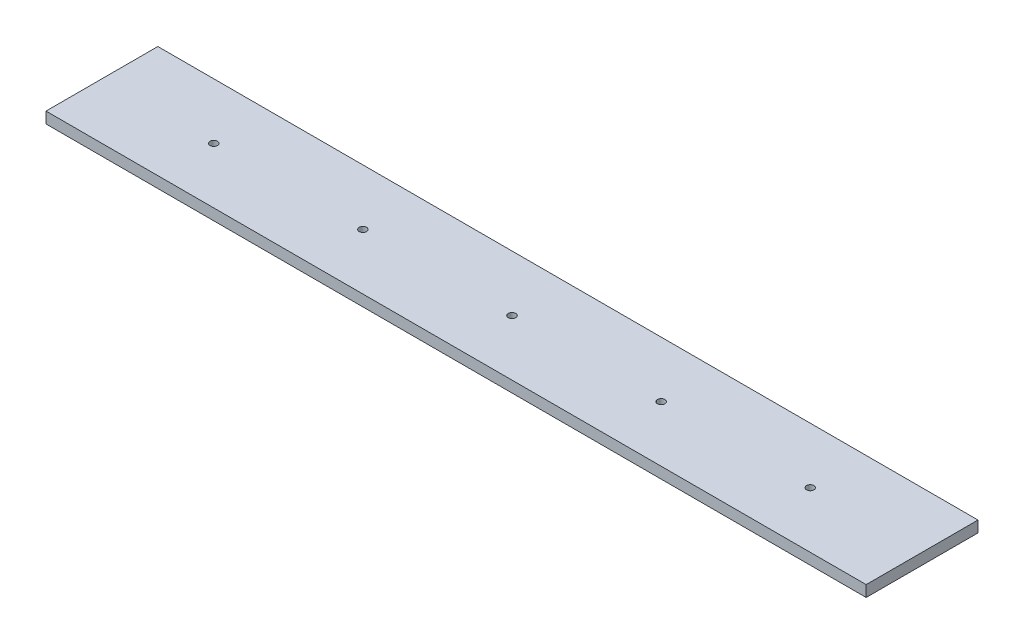
ISO-10303-21;
HEADER;
FILE_DESCRIPTION(('STEP AP214'),'2;1');
FILE_NAME('part.step','',(''),(''),'','','');
FILE_SCHEMA(('AUTOMOTIVE_DESIGN { 1 0 10303 214 1 1 1 1 }'));
ENDSEC;
DATA;
#1=APPLICATION_CONTEXT('core data for automotive mechanical design processes');
#2=APPLICATION_PROTOCOL_DEFINITION('international standard','automotive_design',2000,#1);
#3=PRODUCT_CONTEXT('',#1,'mechanical');
#4=PRODUCT('Part','Part','',(#3));
#5=PRODUCT_RELATED_PRODUCT_CATEGORY('part','',(#4));
#6=PRODUCT_DEFINITION_FORMATION('','',#4);
#7=PRODUCT_DEFINITION_CONTEXT('part definition',#1,'design');
#8=PRODUCT_DEFINITION('design','',#6,#7);
#9=PRODUCT_DEFINITION_SHAPE('','',#8);
#10=(LENGTH_UNIT() NAMED_UNIT(*) SI_UNIT(.MILLI.,.METRE.));
#11=(NAMED_UNIT(*) PLANE_ANGLE_UNIT() SI_UNIT($,.RADIAN.));
#12=(NAMED_UNIT(*) SI_UNIT($,.STERADIAN.) SOLID_ANGLE_UNIT());
#13=UNCERTAINTY_MEASURE_WITH_UNIT(LENGTH_MEASURE(1.E-05),#10,'distance_accuracy_value','');
#14=(GEOMETRIC_REPRESENTATION_CONTEXT(3) GLOBAL_UNCERTAINTY_ASSIGNED_CONTEXT((#13)) GLOBAL_UNIT_ASSIGNED_CONTEXT((#10,
#11,#12)) REPRESENTATION_CONTEXT('',''));
#15=CARTESIAN_POINT('',(0.,0.,0.));
#16=DIRECTION('',(0.,0.,1.));
#17=DIRECTION('',(1.,0.,0.));
#18=AXIS2_PLACEMENT_3D('',#15,#16,#17);
#19=CARTESIAN_POINT('',(0.,3.,0.));
#20=DIRECTION('',(0.,-1.,0.));
#21=DIRECTION('',(0.,0.,-1.));
#22=AXIS2_PLACEMENT_3D('',#19,#20,#21);
#23=PLANE('',#22);
#24=DIRECTION('',(0.,0.,-1.));
#25=VECTOR('',#24,1.);
#26=CARTESIAN_POINT('',(140.,3.,12.5));
#27=LINE('',#26,#25);
#28=CARTESIAN_POINT('',(140.,3.,12.5));
#29=VERTEX_POINT('',#28);
#30=CARTESIAN_POINT('',(140.,3.,-17.5));
#31=VERTEX_POINT('',#30);
#32=EDGE_CURVE('E89',#29,#31,#27,.T.);
#33=ORIENTED_EDGE('',*,*,#32,.T.);
#34=DIRECTION('',(-1.,0.,0.));
#35=VECTOR('',#34,1.);
#36=CARTESIAN_POINT('',(-80.,3.,-17.5));
#37=LINE('',#36,#35);
#38=CARTESIAN_POINT('',(-80.,3.,-17.5));
#39=VERTEX_POINT('',#38);
#40=EDGE_CURVE('E84',#31,#39,#37,.T.);
#41=ORIENTED_EDGE('',*,*,#40,.T.);
#42=DIRECTION('',(0.,0.,1.));
#43=VECTOR('',#42,1.);
#44=CARTESIAN_POINT('',(-80.,3.,12.5));
#45=LINE('',#44,#43);
#46=CARTESIAN_POINT('',(-80.,3.,12.5));
#47=VERTEX_POINT('',#46);
#48=EDGE_CURVE('E87',#39,#47,#45,.T.);
#49=ORIENTED_EDGE('',*,*,#48,.T.);
#50=DIRECTION('',(1.,0.,0.));
#51=VECTOR('',#50,1.);
#52=CARTESIAN_POINT('',(-80.,3.,12.5));
#53=LINE('',#52,#51);
#54=EDGE_CURVE('E54',#47,#29,#53,.T.);
#55=ORIENTED_EDGE('',*,*,#54,.T.);
#56=EDGE_LOOP('',(#33,#41,#49,#55));
#57=FACE_BOUND('',#56,.T.);
#58=CARTESIAN_POINT('',(-50.,3.,-2.5));
#59=DIRECTION('',(0.,1.,0.));
#60=DIRECTION('',(0.,0.,1.));
#61=AXIS2_PLACEMENT_3D('',#58,#59,#60);
#62=CIRCLE('',#61,0.999999999999998);
#63=CARTESIAN_POINT('',(-50.,3.,-1.5));
#64=VERTEX_POINT('',#63);
#65=EDGE_CURVE('E104',#64,#64,#62,.T.);
#66=ORIENTED_EDGE('',*,*,#65,.F.);
#67=EDGE_LOOP('',(#66));
#68=FACE_BOUND('',#67,.T.);
#69=CARTESIAN_POINT('',(-10.,3.,-2.5));
#70=DIRECTION('',(0.,1.,0.));
#71=DIRECTION('',(0.,0.,1.));
#72=AXIS2_PLACEMENT_3D('',#69,#70,#71);
#73=CIRCLE('',#72,1.);
#74=CARTESIAN_POINT('',(-10.,3.,-1.5));
#75=VERTEX_POINT('',#74);
#76=EDGE_CURVE('E119',#75,#75,#73,.T.);
#77=ORIENTED_EDGE('',*,*,#76,.F.);
#78=EDGE_LOOP('',(#77));
#79=FACE_BOUND('',#78,.T.);
#80=CARTESIAN_POINT('',(30.,3.,-2.5));
#81=DIRECTION('',(0.,1.,0.));
#82=DIRECTION('',(0.,0.,1.));
#83=AXIS2_PLACEMENT_3D('',#80,#81,#82);
#84=CIRCLE('',#83,1.);
#85=CARTESIAN_POINT('',(30.,3.,-1.5));
#86=VERTEX_POINT('',#85);
#87=EDGE_CURVE('E125',#86,#86,#84,.T.);
#88=ORIENTED_EDGE('',*,*,#87,.F.);
#89=EDGE_LOOP('',(#88));
#90=FACE_BOUND('',#89,.T.);
#91=CARTESIAN_POINT('',(70.,3.,-2.5));
#92=DIRECTION('',(0.,1.,0.));
#93=DIRECTION('',(0.,0.,1.));
#94=AXIS2_PLACEMENT_3D('',#91,#92,#93);
#95=CIRCLE('',#94,0.999999999999998);
#96=CARTESIAN_POINT('',(70.,3.,-1.5));
#97=VERTEX_POINT('',#96);
#98=EDGE_CURVE('E131',#97,#97,#95,.T.);
#99=ORIENTED_EDGE('',*,*,#98,.F.);
#100=EDGE_LOOP('',(#99));
#101=FACE_BOUND('',#100,.T.);
#102=CARTESIAN_POINT('',(110.,3.,-2.5));
#103=DIRECTION('',(0.,1.,0.));
#104=DIRECTION('',(0.,0.,1.));
#105=AXIS2_PLACEMENT_3D('',#102,#103,#104);
#106=CIRCLE('',#105,0.999999999999998);
#107=CARTESIAN_POINT('',(110.,3.,-1.5));
#108=VERTEX_POINT('',#107);
#109=EDGE_CURVE('E137',#108,#108,#106,.T.);
#110=ORIENTED_EDGE('',*,*,#109,.F.);
#111=EDGE_LOOP('',(#110));
#112=FACE_BOUND('',#111,.T.);
#113=ADVANCED_FACE('F37',(#57,#68,#79,#90,#101,#112),#23,.F.);
#114=CARTESIAN_POINT('',(0.,0.,0.));
#115=DIRECTION('',(0.,-1.,0.));
#116=DIRECTION('',(0.,0.,-1.));
#117=AXIS2_PLACEMENT_3D('',#114,#115,#116);
#118=PLANE('',#117);
#119=CARTESIAN_POINT('',(70.,0.,-2.5));
#120=DIRECTION('',(0.,1.,0.));
#121=DIRECTION('',(0.,0.,1.));
#122=AXIS2_PLACEMENT_3D('',#119,#120,#121);
#123=CIRCLE('',#122,0.999999999999998);
#124=CARTESIAN_POINT('',(70.,0.,-1.5));
#125=VERTEX_POINT('',#124);
#126=EDGE_CURVE('E134',#125,#125,#123,.T.);
#127=ORIENTED_EDGE('',*,*,#126,.T.);
#128=EDGE_LOOP('',(#127));
#129=FACE_BOUND('',#128,.T.);
#130=CARTESIAN_POINT('',(-10.,0.,-2.5));
#131=DIRECTION('',(0.,1.,0.));
#132=DIRECTION('',(0.,0.,1.));
#133=AXIS2_PLACEMENT_3D('',#130,#131,#132);
#134=CIRCLE('',#133,1.);
#135=CARTESIAN_POINT('',(-10.,0.,-1.5));
#136=VERTEX_POINT('',#135);
#137=EDGE_CURVE('E122',#136,#136,#134,.T.);
#138=ORIENTED_EDGE('',*,*,#137,.T.);
#139=EDGE_LOOP('',(#138));
#140=FACE_BOUND('',#139,.T.);
#141=DIRECTION('',(0.,0.,-1.));
#142=VECTOR('',#141,1.);
#143=CARTESIAN_POINT('',(140.,0.,12.5));
#144=LINE('',#143,#142);
#145=CARTESIAN_POINT('',(140.,0.,12.5));
#146=VERTEX_POINT('',#145);
#147=CARTESIAN_POINT('',(140.,0.,-17.5));
#148=VERTEX_POINT('',#147);
#149=EDGE_CURVE('E101',#146,#148,#144,.T.);
#150=ORIENTED_EDGE('',*,*,#149,.F.);
#151=DIRECTION('',(1.,0.,0.));
#152=VECTOR('',#151,1.);
#153=CARTESIAN_POINT('',(-80.,0.,12.5));
#154=LINE('',#153,#152);
#155=CARTESIAN_POINT('',(-80.,0.,12.5));
#156=VERTEX_POINT('',#155);
#157=EDGE_CURVE('E77',#156,#146,#154,.T.);
#158=ORIENTED_EDGE('',*,*,#157,.F.);
#159=DIRECTION('',(0.,0.,1.));
#160=VECTOR('',#159,1.);
#161=CARTESIAN_POINT('',(-80.,0.,12.5));
#162=LINE('',#161,#160);
#163=CARTESIAN_POINT('',(-80.,0.,-17.5));
#164=VERTEX_POINT('',#163);
#165=EDGE_CURVE('E71',#164,#156,#162,.T.);
#166=ORIENTED_EDGE('',*,*,#165,.F.);
#167=DIRECTION('',(-1.,0.,0.));
#168=VECTOR('',#167,1.);
#169=CARTESIAN_POINT('',(-80.,0.,-17.5));
#170=LINE('',#169,#168);
#171=EDGE_CURVE('E93',#148,#164,#170,.T.);
#172=ORIENTED_EDGE('',*,*,#171,.F.);
#173=EDGE_LOOP('',(#150,#158,#166,#172));
#174=FACE_BOUND('',#173,.T.);
#175=CARTESIAN_POINT('',(-50.,0.,-2.5));
#176=DIRECTION('',(0.,1.,0.));
#177=DIRECTION('',(0.,0.,1.));
#178=AXIS2_PLACEMENT_3D('',#175,#176,#177);
#179=CIRCLE('',#178,0.999999999999998);
#180=CARTESIAN_POINT('',(-50.,0.,-1.5));
#181=VERTEX_POINT('',#180);
#182=EDGE_CURVE('E116',#181,#181,#179,.T.);
#183=ORIENTED_EDGE('',*,*,#182,.T.);
#184=EDGE_LOOP('',(#183));
#185=FACE_BOUND('',#184,.T.);
#186=CARTESIAN_POINT('',(30.,0.,-2.5));
#187=DIRECTION('',(0.,1.,0.));
#188=DIRECTION('',(0.,0.,1.));
#189=AXIS2_PLACEMENT_3D('',#186,#187,#188);
#190=CIRCLE('',#189,1.);
#191=CARTESIAN_POINT('',(30.,0.,-1.5));
#192=VERTEX_POINT('',#191);
#193=EDGE_CURVE('E128',#192,#192,#190,.T.);
#194=ORIENTED_EDGE('',*,*,#193,.T.);
#195=EDGE_LOOP('',(#194));
#196=FACE_BOUND('',#195,.T.);
#197=CARTESIAN_POINT('',(110.,0.,-2.5));
#198=DIRECTION('',(0.,1.,0.));
#199=DIRECTION('',(0.,0.,1.));
#200=AXIS2_PLACEMENT_3D('',#197,#198,#199);
#201=CIRCLE('',#200,0.999999999999998);
#202=CARTESIAN_POINT('',(110.,0.,-1.5));
#203=VERTEX_POINT('',#202);
#204=EDGE_CURVE('E140',#203,#203,#201,.T.);
#205=ORIENTED_EDGE('',*,*,#204,.T.);
#206=EDGE_LOOP('',(#205));
#207=FACE_BOUND('',#206,.T.);
#208=ADVANCED_FACE('F112',(#129,#140,#174,#185,#196,#207),#118,.T.);
#209=CARTESIAN_POINT('',(140.,3.,12.5));
#210=DIRECTION('',(-1.,0.,0.));
#211=DIRECTION('',(0.,0.,1.));
#212=AXIS2_PLACEMENT_3D('',#209,#210,#211);
#213=PLANE('',#212);
#214=ORIENTED_EDGE('',*,*,#149,.T.);
#215=DIRECTION('',(0.,-1.,0.));
#216=VECTOR('',#215,1.);
#217=CARTESIAN_POINT('',(140.,3.,-17.5));
#218=LINE('',#217,#216);
#219=EDGE_CURVE('E11',#31,#148,#218,.T.);
#220=ORIENTED_EDGE('',*,*,#219,.F.);
#221=ORIENTED_EDGE('',*,*,#32,.F.);
#222=DIRECTION('',(0.,-1.,0.));
#223=VECTOR('',#222,1.);
#224=CARTESIAN_POINT('',(140.,3.,12.5));
#225=LINE('',#224,#223);
#226=EDGE_CURVE('E97',#29,#146,#225,.T.);
#227=ORIENTED_EDGE('',*,*,#226,.T.);
#228=EDGE_LOOP('',(#214,#220,#221,#227));
#229=FACE_BOUND('',#228,.T.);
#230=ADVANCED_FACE('F39',(#229),#213,.F.);
#231=CARTESIAN_POINT('',(-80.,3.,-17.5));
#232=DIRECTION('',(0.,0.,1.));
#233=DIRECTION('',(1.,0.,0.));
#234=AXIS2_PLACEMENT_3D('',#231,#232,#233);
#235=PLANE('',#234);
#236=ORIENTED_EDGE('',*,*,#171,.T.);
#237=DIRECTION('',(0.,-1.,0.));
#238=VECTOR('',#237,1.);
#239=CARTESIAN_POINT('',(-80.,3.,-17.5));
#240=LINE('',#239,#238);
#241=EDGE_CURVE('E46',#39,#164,#240,.T.);
#242=ORIENTED_EDGE('',*,*,#241,.F.);
#243=ORIENTED_EDGE('',*,*,#40,.F.);
#244=ORIENTED_EDGE('',*,*,#219,.T.);
#245=EDGE_LOOP('',(#236,#242,#243,#244));
#246=FACE_BOUND('',#245,.T.);
#247=ADVANCED_FACE('F92',(#246),#235,.F.);
#248=CARTESIAN_POINT('',(-80.,3.,12.5));
#249=DIRECTION('',(1.,0.,0.));
#250=DIRECTION('',(0.,0.,-1.));
#251=AXIS2_PLACEMENT_3D('',#248,#249,#250);
#252=PLANE('',#251);
#253=ORIENTED_EDGE('',*,*,#165,.T.);
#254=DIRECTION('',(0.,-1.,0.));
#255=VECTOR('',#254,1.);
#256=CARTESIAN_POINT('',(-80.,3.,12.5));
#257=LINE('',#256,#255);
#258=EDGE_CURVE('E94',#47,#156,#257,.T.);
#259=ORIENTED_EDGE('',*,*,#258,.F.);
#260=ORIENTED_EDGE('',*,*,#48,.F.);
#261=ORIENTED_EDGE('',*,*,#241,.T.);
#262=EDGE_LOOP('',(#253,#259,#260,#261));
#263=FACE_BOUND('',#262,.T.);
#264=ADVANCED_FACE('F95',(#263),#252,.F.);
#265=CARTESIAN_POINT('',(-80.,3.,12.5));
#266=DIRECTION('',(0.,0.,-1.));
#267=DIRECTION('',(-1.,0.,0.));
#268=AXIS2_PLACEMENT_3D('',#265,#266,#267);
#269=PLANE('',#268);
#270=ORIENTED_EDGE('',*,*,#157,.T.);
#271=ORIENTED_EDGE('',*,*,#226,.F.);
#272=ORIENTED_EDGE('',*,*,#54,.F.);
#273=ORIENTED_EDGE('',*,*,#258,.T.);
#274=EDGE_LOOP('',(#270,#271,#272,#273));
#275=FACE_BOUND('',#274,.T.);
#276=ADVANCED_FACE('F109',(#275),#269,.F.);
#277=CARTESIAN_POINT('',(-50.,3.,-2.5));
#278=DIRECTION('',(0.,-1.,0.));
#279=DIRECTION('',(0.,0.,-1.));
#280=AXIS2_PLACEMENT_3D('',#277,#278,#279);
#281=CYLINDRICAL_SURFACE('',#280,0.999999999999998);
#282=ORIENTED_EDGE('',*,*,#65,.T.);
#283=EDGE_LOOP('',(#282));
#284=FACE_BOUND('',#283,.T.);
#285=ORIENTED_EDGE('',*,*,#182,.F.);
#286=EDGE_LOOP('',(#285));
#287=FACE_BOUND('',#286,.T.);
#288=ADVANCED_FACE('F157',(#284,#287),#281,.F.);
#289=CARTESIAN_POINT('',(-10.,3.,-2.5));
#290=DIRECTION('',(0.,-1.,0.));
#291=DIRECTION('',(0.,0.,-1.));
#292=AXIS2_PLACEMENT_3D('',#289,#290,#291);
#293=CYLINDRICAL_SURFACE('',#292,1.);
#294=ORIENTED_EDGE('',*,*,#76,.T.);
#295=EDGE_LOOP('',(#294));
#296=FACE_BOUND('',#295,.T.);
#297=ORIENTED_EDGE('',*,*,#137,.F.);
#298=EDGE_LOOP('',(#297));
#299=FACE_BOUND('',#298,.T.);
#300=ADVANCED_FACE('F192',(#296,#299),#293,.F.);
#301=CARTESIAN_POINT('',(30.,3.,-2.5));
#302=DIRECTION('',(0.,-1.,0.));
#303=DIRECTION('',(0.,0.,-1.));
#304=AXIS2_PLACEMENT_3D('',#301,#302,#303);
#305=CYLINDRICAL_SURFACE('',#304,1.);
#306=ORIENTED_EDGE('',*,*,#87,.T.);
#307=EDGE_LOOP('',(#306));
#308=FACE_BOUND('',#307,.T.);
#309=ORIENTED_EDGE('',*,*,#193,.F.);
#310=EDGE_LOOP('',(#309));
#311=FACE_BOUND('',#310,.T.);
#312=ADVANCED_FACE('F199',(#308,#311),#305,.F.);
#313=CARTESIAN_POINT('',(70.,3.,-2.5));
#314=DIRECTION('',(0.,-1.,0.));
#315=DIRECTION('',(0.,0.,-1.));
#316=AXIS2_PLACEMENT_3D('',#313,#314,#315);
#317=CYLINDRICAL_SURFACE('',#316,0.999999999999998);
#318=ORIENTED_EDGE('',*,*,#98,.T.);
#319=EDGE_LOOP('',(#318));
#320=FACE_BOUND('',#319,.T.);
#321=ORIENTED_EDGE('',*,*,#126,.F.);
#322=EDGE_LOOP('',(#321));
#323=FACE_BOUND('',#322,.T.);
#324=ADVANCED_FACE('F206',(#320,#323),#317,.F.);
#325=CARTESIAN_POINT('',(110.,3.,-2.5));
#326=DIRECTION('',(0.,-1.,0.));
#327=DIRECTION('',(0.,0.,-1.));
#328=AXIS2_PLACEMENT_3D('',#325,#326,#327);
#329=CYLINDRICAL_SURFACE('',#328,0.999999999999998);
#330=ORIENTED_EDGE('',*,*,#109,.T.);
#331=EDGE_LOOP('',(#330));
#332=FACE_BOUND('',#331,.T.);
#333=ORIENTED_EDGE('',*,*,#204,.F.);
#334=EDGE_LOOP('',(#333));
#335=FACE_BOUND('',#334,.T.);
#336=ADVANCED_FACE('F146',(#332,#335),#329,.F.);
#337=CLOSED_SHELL('',(#113,#208,#230,#247,#264,#276,#288,#300,#312,#324,#336));
#338=MANIFOLD_SOLID_BREP('B2',#337);
#339=ADVANCED_BREP_SHAPE_REPRESENTATION('',(#18,#338),#14);
#340=SHAPE_DEFINITION_REPRESENTATION(#9,#339);
ENDSEC;
END-ISO-10303-21;
